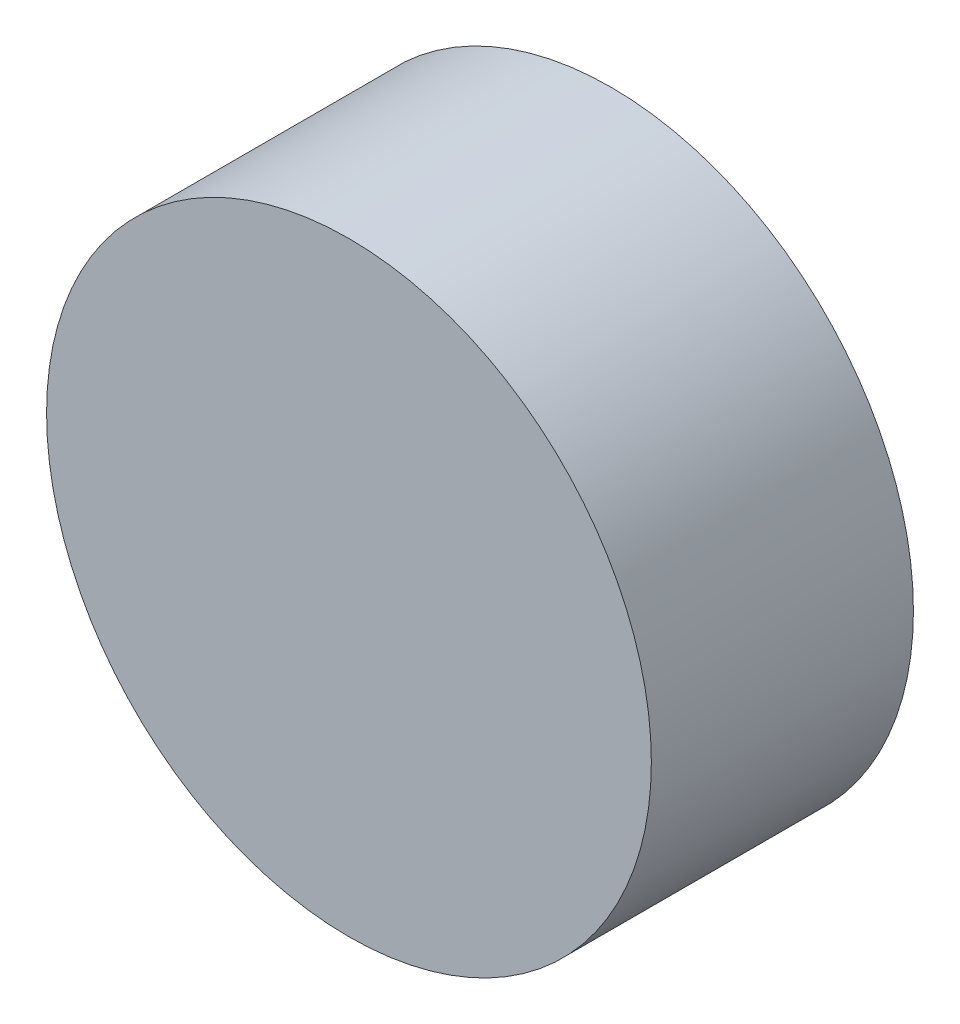
ISO-10303-21;
HEADER;
FILE_DESCRIPTION(('STEP AP214'),'2;1');
FILE_NAME('part.step','',(''),(''),'','','');
FILE_SCHEMA(('AUTOMOTIVE_DESIGN { 1 0 10303 214 1 1 1 1 }'));
ENDSEC;
DATA;
#1=APPLICATION_CONTEXT('core data for automotive mechanical design processes');
#2=APPLICATION_PROTOCOL_DEFINITION('international standard','automotive_design',2000,#1);
#3=PRODUCT_CONTEXT('',#1,'mechanical');
#4=PRODUCT('Part','Part','',(#3));
#5=PRODUCT_RELATED_PRODUCT_CATEGORY('part','',(#4));
#6=PRODUCT_DEFINITION_FORMATION('','',#4);
#7=PRODUCT_DEFINITION_CONTEXT('part definition',#1,'design');
#8=PRODUCT_DEFINITION('design','',#6,#7);
#9=PRODUCT_DEFINITION_SHAPE('','',#8);
#10=(LENGTH_UNIT() NAMED_UNIT(*) SI_UNIT(.MILLI.,.METRE.));
#11=(NAMED_UNIT(*) PLANE_ANGLE_UNIT() SI_UNIT($,.RADIAN.));
#12=(NAMED_UNIT(*) SI_UNIT($,.STERADIAN.) SOLID_ANGLE_UNIT());
#13=UNCERTAINTY_MEASURE_WITH_UNIT(LENGTH_MEASURE(1.E-05),#10,'distance_accuracy_value','');
#14=(GEOMETRIC_REPRESENTATION_CONTEXT(3) GLOBAL_UNCERTAINTY_ASSIGNED_CONTEXT((#13)) GLOBAL_UNIT_ASSIGNED_CONTEXT((#10,
#11,#12)) REPRESENTATION_CONTEXT('',''));
#15=CARTESIAN_POINT('',(0.,0.,0.));
#16=DIRECTION('',(0.,0.,1.));
#17=DIRECTION('',(1.,0.,0.));
#18=AXIS2_PLACEMENT_3D('',#15,#16,#17);
#19=CARTESIAN_POINT('',(0.,0.,26.));
#20=DIRECTION('',(0.,0.,-1.));
#21=DIRECTION('',(-1.,0.,0.));
#22=AXIS2_PLACEMENT_3D('',#19,#20,#21);
#23=CYLINDRICAL_SURFACE('',#22,30.);
#24=CARTESIAN_POINT('',(0.,0.,26.));
#25=DIRECTION('',(0.,0.,1.));
#26=DIRECTION('',(1.,0.,0.));
#27=AXIS2_PLACEMENT_3D('',#24,#25,#26);
#28=CIRCLE('',#27,30.);
#29=CARTESIAN_POINT('',(-30.,0.,26.));
#30=VERTEX_POINT('',#29);
#31=EDGE_CURVE('E10',#30,#30,#28,.T.);
#32=CARTESIAN_POINT('',(0.,0.,0.));
#33=DIRECTION('',(0.,0.,1.));
#34=DIRECTION('',(1.,0.,0.));
#35=AXIS2_PLACEMENT_3D('',#32,#33,#34);
#36=CIRCLE('',#35,30.);
#37=CARTESIAN_POINT('',(-30.,0.,0.));
#38=VERTEX_POINT('',#37);
#39=EDGE_CURVE('E34',#38,#38,#36,.T.);
#40=CARTESIAN_POINT('',(-30.,0.,26.));
#41=CARTESIAN_POINT('',(-30.,0.,25.7291666666667));
#42=CARTESIAN_POINT('',(-30.,0.,25.4583333333333));
#43=CARTESIAN_POINT('',(-30.,0.,24.9166666666667));
#44=CARTESIAN_POINT('',(-30.,0.,24.6458333333333));
#45=CARTESIAN_POINT('',(-30.,0.,24.1041666666667));
#46=CARTESIAN_POINT('',(-30.,0.,23.8333333333333));
#47=CARTESIAN_POINT('',(-30.,0.,23.2916666666667));
#48=CARTESIAN_POINT('',(-30.,0.,23.0208333333333));
#49=CARTESIAN_POINT('',(-30.,0.,22.4791666666667));
#50=CARTESIAN_POINT('',(-30.,0.,22.2083333333333));
#51=CARTESIAN_POINT('',(-30.,0.,21.6666666666667));
#52=CARTESIAN_POINT('',(-30.,0.,21.3958333333333));
#53=CARTESIAN_POINT('',(-30.,0.,20.8541666666667));
#54=CARTESIAN_POINT('',(-30.,0.,20.5833333333333));
#55=CARTESIAN_POINT('',(-30.,0.,20.0416666666667));
#56=CARTESIAN_POINT('',(-30.,0.,19.7708333333333));
#57=CARTESIAN_POINT('',(-30.,0.,19.2291666666667));
#58=CARTESIAN_POINT('',(-30.,0.,18.9583333333333));
#59=CARTESIAN_POINT('',(-30.,0.,18.4166666666667));
#60=CARTESIAN_POINT('',(-30.,0.,18.1458333333333));
#61=CARTESIAN_POINT('',(-30.,0.,17.6041666666667));
#62=CARTESIAN_POINT('',(-30.,0.,17.3333333333333));
#63=CARTESIAN_POINT('',(-30.,0.,16.7916666666667));
#64=CARTESIAN_POINT('',(-30.,0.,16.5208333333333));
#65=CARTESIAN_POINT('',(-30.,0.,15.9791666666667));
#66=CARTESIAN_POINT('',(-30.,0.,15.7083333333333));
#67=CARTESIAN_POINT('',(-30.,0.,15.1666666666667));
#68=CARTESIAN_POINT('',(-30.,0.,14.8958333333333));
#69=CARTESIAN_POINT('',(-30.,0.,14.3541666666667));
#70=CARTESIAN_POINT('',(-30.,0.,14.0833333333333));
#71=CARTESIAN_POINT('',(-30.,0.,13.5416666666667));
#72=CARTESIAN_POINT('',(-30.,0.,13.2708333333333));
#73=CARTESIAN_POINT('',(-30.,0.,12.7291666666667));
#74=CARTESIAN_POINT('',(-30.,0.,12.4583333333333));
#75=CARTESIAN_POINT('',(-30.,0.,11.9166666666667));
#76=CARTESIAN_POINT('',(-30.,0.,11.6458333333333));
#77=CARTESIAN_POINT('',(-30.,0.,11.1041666666667));
#78=CARTESIAN_POINT('',(-30.,0.,10.8333333333333));
#79=CARTESIAN_POINT('',(-30.,0.,10.2916666666667));
#80=CARTESIAN_POINT('',(-30.,0.,10.0208333333333));
#81=CARTESIAN_POINT('',(-30.,0.,9.47916666666667));
#82=CARTESIAN_POINT('',(-30.,0.,9.20833333333333));
#83=CARTESIAN_POINT('',(-30.,0.,8.66666666666667));
#84=CARTESIAN_POINT('',(-30.,0.,8.39583333333333));
#85=CARTESIAN_POINT('',(-30.,0.,7.85416666666667));
#86=CARTESIAN_POINT('',(-30.,0.,7.58333333333333));
#87=CARTESIAN_POINT('',(-30.,0.,7.04166666666667));
#88=CARTESIAN_POINT('',(-30.,0.,6.77083333333333));
#89=CARTESIAN_POINT('',(-30.,0.,6.22916666666667));
#90=CARTESIAN_POINT('',(-30.,0.,5.95833333333333));
#91=CARTESIAN_POINT('',(-30.,0.,5.41666666666667));
#92=CARTESIAN_POINT('',(-30.,0.,5.14583333333333));
#93=CARTESIAN_POINT('',(-30.,0.,4.60416666666667));
#94=CARTESIAN_POINT('',(-30.,0.,4.33333333333333));
#95=CARTESIAN_POINT('',(-30.,0.,3.79166666666667));
#96=CARTESIAN_POINT('',(-30.,0.,3.52083333333333));
#97=CARTESIAN_POINT('',(-30.,0.,2.97916666666667));
#98=CARTESIAN_POINT('',(-30.,0.,2.70833333333333));
#99=CARTESIAN_POINT('',(-30.,0.,2.16666666666667));
#100=CARTESIAN_POINT('',(-30.,0.,1.89583333333333));
#101=CARTESIAN_POINT('',(-30.,0.,1.35416666666667));
#102=CARTESIAN_POINT('',(-30.,0.,1.08333333333333));
#103=CARTESIAN_POINT('',(-30.,0.,0.541666666666667));
#104=CARTESIAN_POINT('',(-30.,0.,0.270833333333334));
#105=CARTESIAN_POINT('',(-30.,0.,0.));
#106=B_SPLINE_CURVE_WITH_KNOTS('',3,(#40,#41,#42,#43,#44,#45,#46,#47,#48,#49,#50,#51,#52,#53,
#54,#55,#56,#57,#58,#59,#60,#61,#62,#63,#64,#65,#66,#67,#68,#69,#70,#71,#72,#73,#74,#75,#76,#77,
#78,#79,#80,#81,#82,#83,#84,#85,#86,#87,#88,#89,#90,#91,#92,#93,#94,#95,#96,#97,#98,#99,#100,
#101,#102,#103,#104,#105),.UNSPECIFIED.,.F.,.F.,(4,2,2,2,2,2,2,2,2,2,2,2,2,2,2,2,2,2,2,2,2,2,2,
2,2,2,2,2,2,2,2,2,4),(0.,0.812500000000001,1.625,2.4375,3.25,4.0625,4.875,5.6875,6.5,7.3125,
8.125,8.9375,9.75,10.5625,11.375,12.1875,13.,13.8125,14.625,15.4375,16.25,17.0625,17.875,
18.6875,19.5,20.3125,21.125,21.9375,22.75,23.5625,24.375,25.1875,26.),.UNSPECIFIED.);
#107=EDGE_CURVE('BSEAM31',#30,#38,#106,.T.);
#108=ORIENTED_EDGE('',*,*,#31,.F.);
#109=ORIENTED_EDGE('',*,*,#39,.T.);
#110=ORIENTED_EDGE('',*,*,#107,.T.);
#111=ORIENTED_EDGE('',*,*,#107,.F.);
#112=EDGE_LOOP('',(#108,#110,#109,#111));
#113=FACE_BOUND('',#112,.T.);
#114=ADVANCED_FACE('F31',(#113),#23,.T.);
#115=CARTESIAN_POINT('',(0.,0.,26.));
#116=DIRECTION('',(0.,0.,1.));
#117=DIRECTION('',(1.,0.,0.));
#118=AXIS2_PLACEMENT_3D('',#115,#116,#117);
#119=PLANE('',#118);
#120=ORIENTED_EDGE('',*,*,#31,.T.);
#121=EDGE_LOOP('',(#120));
#122=FACE_BOUND('',#121,.T.);
#123=ADVANCED_FACE('F61',(#122),#119,.T.);
#124=CARTESIAN_POINT('',(0.,0.,0.));
#125=DIRECTION('',(0.,0.,1.));
#126=DIRECTION('',(1.,0.,0.));
#127=AXIS2_PLACEMENT_3D('',#124,#125,#126);
#128=PLANE('',#127);
#129=CARTESIAN_POINT('',(0.,0.,0.));
#130=DIRECTION('',(0.,0.,1.));
#131=DIRECTION('',(1.,0.,0.));
#132=AXIS2_PLACEMENT_3D('',#129,#130,#131);
#133=CIRCLE('',#132,3.);
#134=CARTESIAN_POINT('',(3.,0.,0.));
#135=VERTEX_POINT('',#134);
#136=EDGE_CURVE('E43',#135,#135,#133,.T.);
#137=ORIENTED_EDGE('',*,*,#136,.T.);
#138=EDGE_LOOP('',(#137));
#139=FACE_BOUND('',#138,.T.);
#140=ORIENTED_EDGE('',*,*,#39,.F.);
#141=EDGE_LOOP('',(#140));
#142=FACE_BOUND('',#141,.T.);
#143=ADVANCED_FACE('F58',(#139,#142),#128,.F.);
#144=CARTESIAN_POINT('',(0.,0.,10.));
#145=DIRECTION('',(0.,0.,-1.));
#146=DIRECTION('',(-1.,0.,0.));
#147=AXIS2_PLACEMENT_3D('',#144,#145,#146);
#148=CYLINDRICAL_SURFACE('',#147,3.);
#149=CARTESIAN_POINT('',(0.,0.,10.));
#150=DIRECTION('',(0.,0.,1.));
#151=DIRECTION('',(1.,0.,0.));
#152=AXIS2_PLACEMENT_3D('',#149,#150,#151);
#153=CIRCLE('',#152,3.);
#154=CARTESIAN_POINT('',(3.,0.,10.));
#155=VERTEX_POINT('',#154);
#156=EDGE_CURVE('E41',#155,#155,#153,.T.);
#157=ORIENTED_EDGE('',*,*,#156,.T.);
#158=EDGE_LOOP('',(#157));
#159=FACE_BOUND('',#158,.T.);
#160=ORIENTED_EDGE('',*,*,#136,.F.);
#161=EDGE_LOOP('',(#160));
#162=FACE_BOUND('',#161,.T.);
#163=ADVANCED_FACE('F49',(#159,#162),#148,.F.);
#164=CARTESIAN_POINT('',(0.,0.,10.));
#165=DIRECTION('',(0.,0.,1.));
#166=DIRECTION('',(1.,0.,0.));
#167=AXIS2_PLACEMENT_3D('',#164,#165,#166);
#168=PLANE('',#167);
#169=ORIENTED_EDGE('',*,*,#156,.F.);
#170=EDGE_LOOP('',(#169));
#171=FACE_BOUND('',#170,.T.);
#172=ADVANCED_FACE('F52',(#171),#168,.F.);
#173=CLOSED_SHELL('',(#114,#123,#143,#163,#172));
#174=MANIFOLD_SOLID_BREP('B2',#173);
#175=ADVANCED_BREP_SHAPE_REPRESENTATION('',(#18,#174),#14);
#176=SHAPE_DEFINITION_REPRESENTATION(#9,#175);
ENDSEC;
END-ISO-10303-21;
